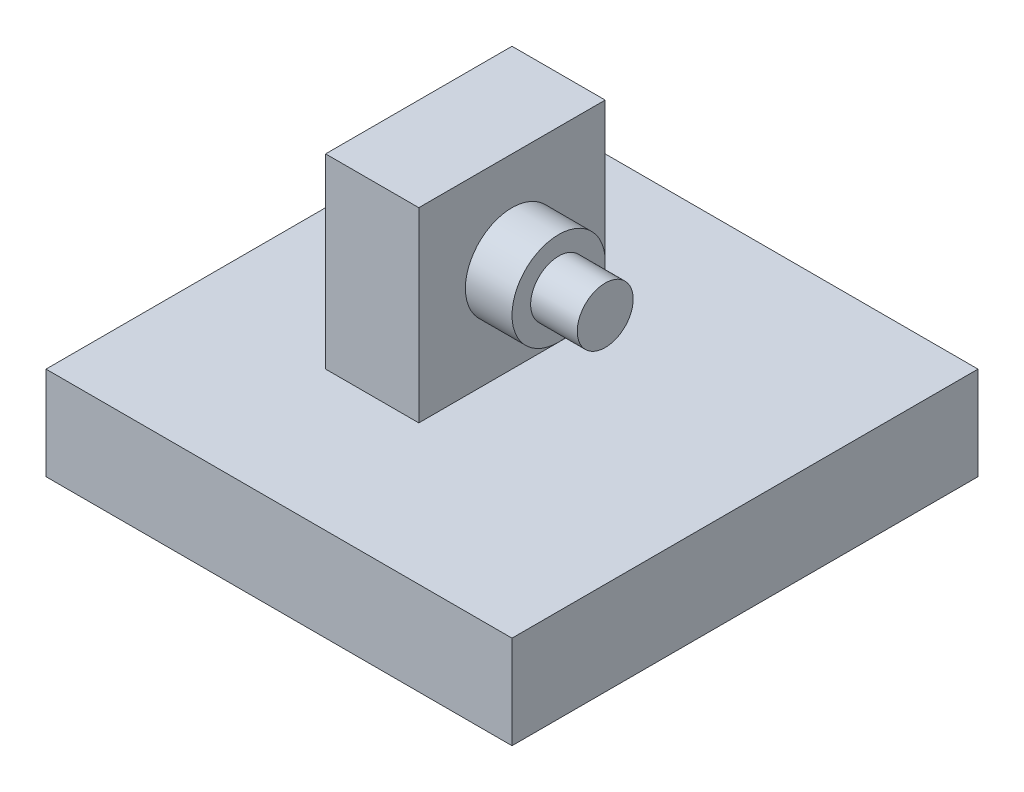
ISO-10303-21;
HEADER;
FILE_DESCRIPTION(('STEP AP214'),'2;1');
FILE_NAME('part.step','',(''),(''),'','','');
FILE_SCHEMA(('AUTOMOTIVE_DESIGN { 1 0 10303 214 1 1 1 1 }'));
ENDSEC;
DATA;
#1=APPLICATION_CONTEXT('core data for automotive mechanical design processes');
#2=APPLICATION_PROTOCOL_DEFINITION('international standard','automotive_design',2000,#1);
#3=PRODUCT_CONTEXT('',#1,'mechanical');
#4=PRODUCT('Part','Part','',(#3));
#5=PRODUCT_RELATED_PRODUCT_CATEGORY('part','',(#4));
#6=PRODUCT_DEFINITION_FORMATION('','',#4);
#7=PRODUCT_DEFINITION_CONTEXT('part definition',#1,'design');
#8=PRODUCT_DEFINITION('design','',#6,#7);
#9=PRODUCT_DEFINITION_SHAPE('','',#8);
#10=(LENGTH_UNIT() NAMED_UNIT(*) SI_UNIT(.MILLI.,.METRE.));
#11=(NAMED_UNIT(*) PLANE_ANGLE_UNIT() SI_UNIT($,.RADIAN.));
#12=(NAMED_UNIT(*) SI_UNIT($,.STERADIAN.) SOLID_ANGLE_UNIT());
#13=UNCERTAINTY_MEASURE_WITH_UNIT(LENGTH_MEASURE(1.E-05),#10,'distance_accuracy_value','');
#14=(GEOMETRIC_REPRESENTATION_CONTEXT(3) GLOBAL_UNCERTAINTY_ASSIGNED_CONTEXT((#13)) GLOBAL_UNIT_ASSIGNED_CONTEXT((#10,
#11,#12)) REPRESENTATION_CONTEXT('',''));
#15=CARTESIAN_POINT('',(0.,0.,0.));
#16=DIRECTION('',(0.,0.,1.));
#17=DIRECTION('',(1.,0.,0.));
#18=AXIS2_PLACEMENT_3D('',#15,#16,#17);
#19=CARTESIAN_POINT('',(0.,100.,0.));
#20=DIRECTION('',(0.,1.,0.));
#21=DIRECTION('',(0.,0.,1.));
#22=AXIS2_PLACEMENT_3D('',#19,#20,#21);
#23=PLANE('',#22);
#24=DIRECTION('',(0.,0.,1.));
#25=VECTOR('',#24,1.);
#26=CARTESIAN_POINT('',(-250.,100.,250.));
#27=LINE('',#26,#25);
#28=CARTESIAN_POINT('',(-250.,100.,-250.));
#29=VERTEX_POINT('',#28);
#30=CARTESIAN_POINT('',(-250.,100.,250.));
#31=VERTEX_POINT('',#30);
#32=EDGE_CURVE('E154',#29,#31,#27,.T.);
#33=ORIENTED_EDGE('',*,*,#32,.T.);
#34=DIRECTION('',(1.,0.,0.));
#35=VECTOR('',#34,1.);
#36=CARTESIAN_POINT('',(250.,100.,250.));
#37=LINE('',#36,#35);
#38=CARTESIAN_POINT('',(250.,100.,250.));
#39=VERTEX_POINT('',#38);
#40=EDGE_CURVE('E94',#31,#39,#37,.T.);
#41=ORIENTED_EDGE('',*,*,#40,.T.);
#42=DIRECTION('',(0.,0.,-1.));
#43=VECTOR('',#42,1.);
#44=CARTESIAN_POINT('',(250.,100.,250.));
#45=LINE('',#44,#43);
#46=CARTESIAN_POINT('',(250.,100.,-250.));
#47=VERTEX_POINT('',#46);
#48=EDGE_CURVE('E159',#39,#47,#45,.T.);
#49=ORIENTED_EDGE('',*,*,#48,.T.);
#50=DIRECTION('',(-1.,0.,0.));
#51=VECTOR('',#50,1.);
#52=CARTESIAN_POINT('',(250.,100.,-250.));
#53=LINE('',#52,#51);
#54=EDGE_CURVE('E65',#47,#29,#53,.T.);
#55=ORIENTED_EDGE('',*,*,#54,.T.);
#56=EDGE_LOOP('',(#33,#41,#49,#55));
#57=FACE_BOUND('',#56,.T.);
#58=DIRECTION('',(1.,0.,0.));
#59=VECTOR('',#58,1.);
#60=CARTESIAN_POINT('',(0.,100.,100.));
#61=LINE('',#60,#59);
#62=CARTESIAN_POINT('',(-100.,100.,100.));
#63=VERTEX_POINT('',#62);
#64=CARTESIAN_POINT('',(0.,100.,100.));
#65=VERTEX_POINT('',#64);
#66=EDGE_CURVE('E199',#63,#65,#61,.T.);
#67=ORIENTED_EDGE('',*,*,#66,.F.);
#68=DIRECTION('',(0.,0.,1.));
#69=VECTOR('',#68,1.);
#70=CARTESIAN_POINT('',(-100.,100.,100.));
#71=LINE('',#70,#69);
#72=CARTESIAN_POINT('',(-100.,100.,-100.));
#73=VERTEX_POINT('',#72);
#74=EDGE_CURVE('E141',#73,#63,#71,.T.);
#75=ORIENTED_EDGE('',*,*,#74,.F.);
#76=DIRECTION('',(-1.,0.,0.));
#77=VECTOR('',#76,1.);
#78=CARTESIAN_POINT('',(0.,100.,-100.));
#79=LINE('',#78,#77);
#80=CARTESIAN_POINT('',(0.,100.,-100.));
#81=VERTEX_POINT('',#80);
#82=EDGE_CURVE('E137',#81,#73,#79,.T.);
#83=ORIENTED_EDGE('',*,*,#82,.F.);
#84=DIRECTION('',(0.,0.,-1.));
#85=VECTOR('',#84,1.);
#86=CARTESIAN_POINT('',(0.,100.,100.));
#87=LINE('',#86,#85);
#88=EDGE_CURVE('E195',#65,#81,#87,.T.);
#89=ORIENTED_EDGE('',*,*,#88,.F.);
#90=EDGE_LOOP('',(#67,#75,#83,#89));
#91=FACE_BOUND('',#90,.T.);
#92=ADVANCED_FACE('F39',(#57,#91),#23,.T.);
#93=CARTESIAN_POINT('',(-250.,100.,250.));
#94=DIRECTION('',(1.,0.,0.));
#95=DIRECTION('',(0.,0.,-1.));
#96=AXIS2_PLACEMENT_3D('',#93,#94,#95);
#97=PLANE('',#96);
#98=DIRECTION('',(0.,0.,1.));
#99=VECTOR('',#98,1.);
#100=CARTESIAN_POINT('',(-250.,0.,250.));
#101=LINE('',#100,#99);
#102=CARTESIAN_POINT('',(-250.,0.,-250.));
#103=VERTEX_POINT('',#102);
#104=CARTESIAN_POINT('',(-250.,0.,250.));
#105=VERTEX_POINT('',#104);
#106=EDGE_CURVE('E144',#103,#105,#101,.T.);
#107=ORIENTED_EDGE('',*,*,#106,.T.);
#108=DIRECTION('',(0.,-1.,0.));
#109=VECTOR('',#108,1.);
#110=CARTESIAN_POINT('',(-250.,100.,250.));
#111=LINE('',#110,#109);
#112=EDGE_CURVE('E180',#31,#105,#111,.T.);
#113=ORIENTED_EDGE('',*,*,#112,.F.);
#114=ORIENTED_EDGE('',*,*,#32,.F.);
#115=DIRECTION('',(0.,-1.,0.));
#116=VECTOR('',#115,1.);
#117=CARTESIAN_POINT('',(-250.,100.,-250.));
#118=LINE('',#117,#116);
#119=EDGE_CURVE('E163',#29,#103,#118,.T.);
#120=ORIENTED_EDGE('',*,*,#119,.T.);
#121=EDGE_LOOP('',(#107,#113,#114,#120));
#122=FACE_BOUND('',#121,.T.);
#123=ADVANCED_FACE('F41',(#122),#97,.F.);
#124=CARTESIAN_POINT('',(250.,100.,250.));
#125=DIRECTION('',(0.,0.,-1.));
#126=DIRECTION('',(-1.,0.,0.));
#127=AXIS2_PLACEMENT_3D('',#124,#125,#126);
#128=PLANE('',#127);
#129=DIRECTION('',(1.,0.,0.));
#130=VECTOR('',#129,1.);
#131=CARTESIAN_POINT('',(250.,0.,250.));
#132=LINE('',#131,#130);
#133=CARTESIAN_POINT('',(250.,0.,250.));
#134=VERTEX_POINT('',#133);
#135=EDGE_CURVE('E149',#105,#134,#132,.T.);
#136=ORIENTED_EDGE('',*,*,#135,.T.);
#137=DIRECTION('',(0.,-1.,0.));
#138=VECTOR('',#137,1.);
#139=CARTESIAN_POINT('',(250.,100.,250.));
#140=LINE('',#139,#138);
#141=EDGE_CURVE('E177',#39,#134,#140,.T.);
#142=ORIENTED_EDGE('',*,*,#141,.F.);
#143=ORIENTED_EDGE('',*,*,#40,.F.);
#144=ORIENTED_EDGE('',*,*,#112,.T.);
#145=EDGE_LOOP('',(#136,#142,#143,#144));
#146=FACE_BOUND('',#145,.T.);
#147=ADVANCED_FACE('F250',(#146),#128,.F.);
#148=CARTESIAN_POINT('',(250.,100.,250.));
#149=DIRECTION('',(-1.,0.,0.));
#150=DIRECTION('',(0.,0.,1.));
#151=AXIS2_PLACEMENT_3D('',#148,#149,#150);
#152=PLANE('',#151);
#153=DIRECTION('',(0.,0.,-1.));
#154=VECTOR('',#153,1.);
#155=CARTESIAN_POINT('',(250.,0.,250.));
#156=LINE('',#155,#154);
#157=CARTESIAN_POINT('',(250.,0.,-250.));
#158=VERTEX_POINT('',#157);
#159=EDGE_CURVE('E167',#134,#158,#156,.T.);
#160=ORIENTED_EDGE('',*,*,#159,.T.);
#161=DIRECTION('',(0.,-1.,0.));
#162=VECTOR('',#161,1.);
#163=CARTESIAN_POINT('',(250.,100.,-250.));
#164=LINE('',#163,#162);
#165=EDGE_CURVE('E174',#47,#158,#164,.T.);
#166=ORIENTED_EDGE('',*,*,#165,.F.);
#167=ORIENTED_EDGE('',*,*,#48,.F.);
#168=ORIENTED_EDGE('',*,*,#141,.T.);
#169=EDGE_LOOP('',(#160,#166,#167,#168));
#170=FACE_BOUND('',#169,.T.);
#171=ADVANCED_FACE('F262',(#170),#152,.F.);
#172=CARTESIAN_POINT('',(250.,100.,-250.));
#173=DIRECTION('',(0.,0.,1.));
#174=DIRECTION('',(1.,0.,0.));
#175=AXIS2_PLACEMENT_3D('',#172,#173,#174);
#176=PLANE('',#175);
#177=DIRECTION('',(-1.,0.,0.));
#178=VECTOR('',#177,1.);
#179=CARTESIAN_POINT('',(250.,0.,-250.));
#180=LINE('',#179,#178);
#181=EDGE_CURVE('E86',#158,#103,#180,.T.);
#182=ORIENTED_EDGE('',*,*,#181,.T.);
#183=ORIENTED_EDGE('',*,*,#119,.F.);
#184=ORIENTED_EDGE('',*,*,#54,.F.);
#185=ORIENTED_EDGE('',*,*,#165,.T.);
#186=EDGE_LOOP('',(#182,#183,#184,#185));
#187=FACE_BOUND('',#186,.T.);
#188=ADVANCED_FACE('F258',(#187),#176,.F.);
#189=CARTESIAN_POINT('',(0.,0.,0.));
#190=DIRECTION('',(0.,1.,0.));
#191=DIRECTION('',(0.,0.,1.));
#192=AXIS2_PLACEMENT_3D('',#189,#190,#191);
#193=PLANE('',#192);
#194=ORIENTED_EDGE('',*,*,#106,.F.);
#195=ORIENTED_EDGE('',*,*,#181,.F.);
#196=ORIENTED_EDGE('',*,*,#159,.F.);
#197=ORIENTED_EDGE('',*,*,#135,.F.);
#198=EDGE_LOOP('',(#194,#195,#196,#197));
#199=FACE_BOUND('',#198,.T.);
#200=ADVANCED_FACE('F255',(#199),#193,.F.);
#201=CARTESIAN_POINT('',(-100.,300.,100.));
#202=DIRECTION('',(1.,0.,0.));
#203=DIRECTION('',(0.,0.,-1.));
#204=AXIS2_PLACEMENT_3D('',#201,#202,#203);
#205=PLANE('',#204);
#206=ORIENTED_EDGE('',*,*,#74,.T.);
#207=DIRECTION('',(0.,-1.,0.));
#208=VECTOR('',#207,1.);
#209=CARTESIAN_POINT('',(-100.,300.,100.));
#210=LINE('',#209,#208);
#211=CARTESIAN_POINT('',(-100.,300.,100.));
#212=VERTEX_POINT('',#211);
#213=EDGE_CURVE('E120',#212,#63,#210,.T.);
#214=ORIENTED_EDGE('',*,*,#213,.F.);
#215=DIRECTION('',(0.,0.,1.));
#216=VECTOR('',#215,1.);
#217=CARTESIAN_POINT('',(-100.,300.,100.));
#218=LINE('',#217,#216);
#219=CARTESIAN_POINT('',(-100.,300.,-100.));
#220=VERTEX_POINT('',#219);
#221=EDGE_CURVE('E128',#220,#212,#218,.T.);
#222=ORIENTED_EDGE('',*,*,#221,.F.);
#223=DIRECTION('',(0.,-1.,0.));
#224=VECTOR('',#223,1.);
#225=CARTESIAN_POINT('',(-100.,300.,-100.));
#226=LINE('',#225,#224);
#227=EDGE_CURVE('E205',#220,#73,#226,.T.);
#228=ORIENTED_EDGE('',*,*,#227,.T.);
#229=EDGE_LOOP('',(#206,#214,#222,#228));
#230=FACE_BOUND('',#229,.T.);
#231=ADVANCED_FACE('F139',(#230),#205,.F.);
#232=CARTESIAN_POINT('',(0.,300.,100.));
#233=DIRECTION('',(0.,0.,-1.));
#234=DIRECTION('',(-1.,0.,0.));
#235=AXIS2_PLACEMENT_3D('',#232,#233,#234);
#236=PLANE('',#235);
#237=ORIENTED_EDGE('',*,*,#66,.T.);
#238=DIRECTION('',(0.,-1.,0.));
#239=VECTOR('',#238,1.);
#240=CARTESIAN_POINT('',(0.,300.,100.));
#241=LINE('',#240,#239);
#242=CARTESIAN_POINT('',(0.,300.,100.));
#243=VERTEX_POINT('',#242);
#244=EDGE_CURVE('E123',#243,#65,#241,.T.);
#245=ORIENTED_EDGE('',*,*,#244,.F.);
#246=DIRECTION('',(1.,0.,0.));
#247=VECTOR('',#246,1.);
#248=CARTESIAN_POINT('',(0.,300.,100.));
#249=LINE('',#248,#247);
#250=EDGE_CURVE('E116',#212,#243,#249,.T.);
#251=ORIENTED_EDGE('',*,*,#250,.F.);
#252=ORIENTED_EDGE('',*,*,#213,.T.);
#253=EDGE_LOOP('',(#237,#245,#251,#252));
#254=FACE_BOUND('',#253,.T.);
#255=ADVANCED_FACE('F118',(#254),#236,.F.);
#256=CARTESIAN_POINT('',(0.,300.,100.));
#257=DIRECTION('',(-1.,0.,0.));
#258=DIRECTION('',(0.,0.,1.));
#259=AXIS2_PLACEMENT_3D('',#256,#257,#258);
#260=PLANE('',#259);
#261=CARTESIAN_POINT('',(0.,200.,0.));
#262=DIRECTION('',(-1.,0.,0.));
#263=DIRECTION('',(0.,0.,1.));
#264=AXIS2_PLACEMENT_3D('',#261,#262,#263);
#265=CIRCLE('',#264,50.);
#266=CARTESIAN_POINT('',(0.,200.,50.));
#267=VERTEX_POINT('',#266);
#268=EDGE_CURVE('E43',#267,#267,#265,.F.);
#269=ORIENTED_EDGE('',*,*,#268,.F.);
#270=EDGE_LOOP('',(#269));
#271=FACE_BOUND('',#270,.T.);
#272=ORIENTED_EDGE('',*,*,#88,.T.);
#273=DIRECTION('',(0.,-1.,0.));
#274=VECTOR('',#273,1.);
#275=CARTESIAN_POINT('',(0.,300.,-100.));
#276=LINE('',#275,#274);
#277=CARTESIAN_POINT('',(0.,300.,-100.));
#278=VERTEX_POINT('',#277);
#279=EDGE_CURVE('E56',#278,#81,#276,.T.);
#280=ORIENTED_EDGE('',*,*,#279,.F.);
#281=DIRECTION('',(0.,0.,-1.));
#282=VECTOR('',#281,1.);
#283=CARTESIAN_POINT('',(0.,300.,100.));
#284=LINE('',#283,#282);
#285=EDGE_CURVE('E127',#243,#278,#284,.T.);
#286=ORIENTED_EDGE('',*,*,#285,.F.);
#287=ORIENTED_EDGE('',*,*,#244,.T.);
#288=EDGE_LOOP('',(#272,#280,#286,#287));
#289=FACE_BOUND('',#288,.T.);
#290=ADVANCED_FACE('F189',(#271,#289),#260,.F.);
#291=CARTESIAN_POINT('',(0.,300.,-100.));
#292=DIRECTION('',(0.,0.,1.));
#293=DIRECTION('',(1.,0.,0.));
#294=AXIS2_PLACEMENT_3D('',#291,#292,#293);
#295=PLANE('',#294);
#296=ORIENTED_EDGE('',*,*,#82,.T.);
#297=ORIENTED_EDGE('',*,*,#227,.F.);
#298=DIRECTION('',(-1.,0.,0.));
#299=VECTOR('',#298,1.);
#300=CARTESIAN_POINT('',(0.,300.,-100.));
#301=LINE('',#300,#299);
#302=EDGE_CURVE('E132',#278,#220,#301,.T.);
#303=ORIENTED_EDGE('',*,*,#302,.F.);
#304=ORIENTED_EDGE('',*,*,#279,.T.);
#305=EDGE_LOOP('',(#296,#297,#303,#304));
#306=FACE_BOUND('',#305,.T.);
#307=ADVANCED_FACE('F192',(#306),#295,.F.);
#308=CARTESIAN_POINT('',(0.,300.,0.));
#309=DIRECTION('',(0.,1.,0.));
#310=DIRECTION('',(0.,0.,1.));
#311=AXIS2_PLACEMENT_3D('',#308,#309,#310);
#312=PLANE('',#311);
#313=ORIENTED_EDGE('',*,*,#221,.T.);
#314=ORIENTED_EDGE('',*,*,#250,.T.);
#315=ORIENTED_EDGE('',*,*,#285,.T.);
#316=ORIENTED_EDGE('',*,*,#302,.T.);
#317=EDGE_LOOP('',(#313,#314,#315,#316));
#318=FACE_BOUND('',#317,.T.);
#319=ADVANCED_FACE('F131',(#318),#312,.T.);
#320=CARTESIAN_POINT('',(50.,200.,0.));
#321=DIRECTION('',(-1.,0.,0.));
#322=DIRECTION('',(0.,0.,1.));
#323=AXIS2_PLACEMENT_3D('',#320,#321,#322);
#324=CYLINDRICAL_SURFACE('',#323,50.);
#325=CARTESIAN_POINT('',(50.,200.,0.));
#326=DIRECTION('',(1.,0.,0.));
#327=DIRECTION('',(0.,0.,-1.));
#328=AXIS2_PLACEMENT_3D('',#325,#326,#327);
#329=CIRCLE('',#328,50.);
#330=CARTESIAN_POINT('',(50.,200.,-50.));
#331=VERTEX_POINT('',#330);
#332=EDGE_CURVE('E214',#331,#331,#329,.T.);
#333=ORIENTED_EDGE('',*,*,#332,.F.);
#334=EDGE_LOOP('',(#333));
#335=FACE_BOUND('',#334,.T.);
#336=ORIENTED_EDGE('',*,*,#268,.T.);
#337=EDGE_LOOP('',(#336));
#338=FACE_BOUND('',#337,.T.);
#339=ADVANCED_FACE('F187',(#335,#338),#324,.T.);
#340=CARTESIAN_POINT('',(50.,200.,0.));
#341=DIRECTION('',(1.,0.,0.));
#342=DIRECTION('',(0.,0.,-1.));
#343=AXIS2_PLACEMENT_3D('',#340,#341,#342);
#344=PLANE('',#343);
#345=CARTESIAN_POINT('',(50.,200.,0.));
#346=DIRECTION('',(1.,0.,0.));
#347=DIRECTION('',(0.,0.,-1.));
#348=AXIS2_PLACEMENT_3D('',#345,#346,#347);
#349=CIRCLE('',#348,30.);
#350=CARTESIAN_POINT('',(50.,200.,-30.));
#351=VERTEX_POINT('',#350);
#352=EDGE_CURVE('E11',#351,#351,#349,.T.);
#353=ORIENTED_EDGE('',*,*,#352,.F.);
#354=EDGE_LOOP('',(#353));
#355=FACE_BOUND('',#354,.T.);
#356=ORIENTED_EDGE('',*,*,#332,.T.);
#357=EDGE_LOOP('',(#356));
#358=FACE_BOUND('',#357,.T.);
#359=ADVANCED_FACE('F230',(#355,#358),#344,.T.);
#360=CARTESIAN_POINT('',(100.,200.,0.));
#361=DIRECTION('',(-1.,0.,0.));
#362=DIRECTION('',(0.,0.,1.));
#363=AXIS2_PLACEMENT_3D('',#360,#361,#362);
#364=CYLINDRICAL_SURFACE('',#363,30.);
#365=CARTESIAN_POINT('',(100.,200.,0.));
#366=DIRECTION('',(1.,0.,0.));
#367=DIRECTION('',(0.,0.,-1.));
#368=AXIS2_PLACEMENT_3D('',#365,#366,#367);
#369=CIRCLE('',#368,30.);
#370=CARTESIAN_POINT('',(100.,200.,-30.));
#371=VERTEX_POINT('',#370);
#372=EDGE_CURVE('E219',#371,#371,#369,.T.);
#373=ORIENTED_EDGE('',*,*,#372,.F.);
#374=EDGE_LOOP('',(#373));
#375=FACE_BOUND('',#374,.T.);
#376=ORIENTED_EDGE('',*,*,#352,.T.);
#377=EDGE_LOOP('',(#376));
#378=FACE_BOUND('',#377,.T.);
#379=ADVANCED_FACE('F227',(#375,#378),#364,.T.);
#380=CARTESIAN_POINT('',(100.,200.,0.));
#381=DIRECTION('',(1.,0.,0.));
#382=DIRECTION('',(0.,0.,-1.));
#383=AXIS2_PLACEMENT_3D('',#380,#381,#382);
#384=PLANE('',#383);
#385=ORIENTED_EDGE('',*,*,#372,.T.);
#386=EDGE_LOOP('',(#385));
#387=FACE_BOUND('',#386,.T.);
#388=ADVANCED_FACE('F225',(#387),#384,.T.);
#389=CLOSED_SHELL('',(#92,#123,#147,#171,#188,#200,#231,#255,#290,#307,#319,#339,#359,#379,#388));
#390=MANIFOLD_SOLID_BREP('B2',#389);
#391=ADVANCED_BREP_SHAPE_REPRESENTATION('',(#18,#390),#14);
#392=SHAPE_DEFINITION_REPRESENTATION(#9,#391);
ENDSEC;
END-ISO-10303-21;
